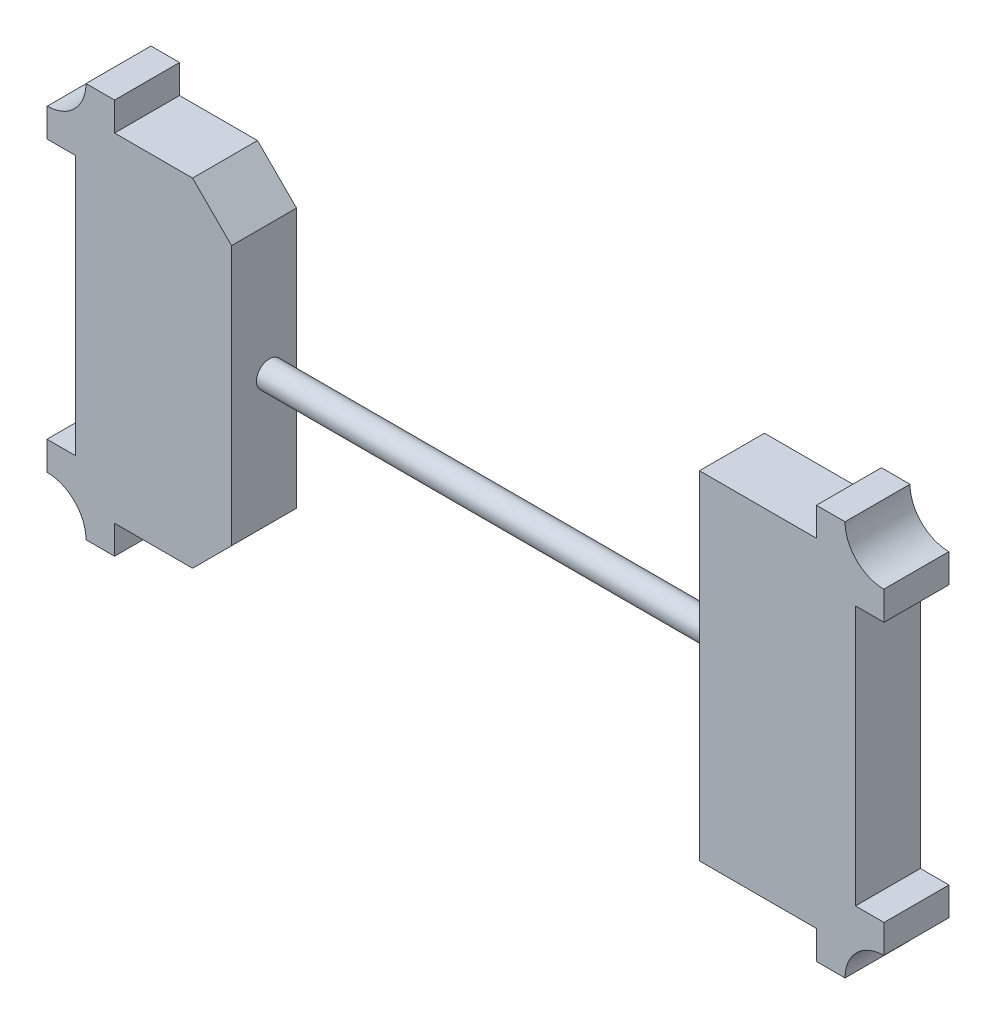
ISO-10303-21;
HEADER;
FILE_DESCRIPTION(('STEP AP214'),'2;1');
FILE_NAME('part.step','',(''),(''),'','','');
FILE_SCHEMA(('AUTOMOTIVE_DESIGN { 1 0 10303 214 1 1 1 1 }'));
ENDSEC;
DATA;
#1=APPLICATION_CONTEXT('core data for automotive mechanical design processes');
#2=APPLICATION_PROTOCOL_DEFINITION('international standard','automotive_design',2000,#1);
#3=PRODUCT_CONTEXT('',#1,'mechanical');
#4=PRODUCT('Part','Part','',(#3));
#5=PRODUCT_RELATED_PRODUCT_CATEGORY('part','',(#4));
#6=PRODUCT_DEFINITION_FORMATION('','',#4);
#7=PRODUCT_DEFINITION_CONTEXT('part definition',#1,'design');
#8=PRODUCT_DEFINITION('design','',#6,#7);
#9=PRODUCT_DEFINITION_SHAPE('','',#8);
#10=(LENGTH_UNIT() NAMED_UNIT(*) SI_UNIT(.MILLI.,.METRE.));
#11=(NAMED_UNIT(*) PLANE_ANGLE_UNIT() SI_UNIT($,.RADIAN.));
#12=(NAMED_UNIT(*) SI_UNIT($,.STERADIAN.) SOLID_ANGLE_UNIT());
#13=UNCERTAINTY_MEASURE_WITH_UNIT(LENGTH_MEASURE(1.E-05),#10,'distance_accuracy_value','');
#14=(GEOMETRIC_REPRESENTATION_CONTEXT(3) GLOBAL_UNCERTAINTY_ASSIGNED_CONTEXT((#13)) GLOBAL_UNIT_ASSIGNED_CONTEXT((#10,
#11,#12)) REPRESENTATION_CONTEXT('',''));
#15=CARTESIAN_POINT('',(0.,0.,0.));
#16=DIRECTION('',(0.,0.,1.));
#17=DIRECTION('',(1.,0.,0.));
#18=AXIS2_PLACEMENT_3D('',#15,#16,#17);
#19=CARTESIAN_POINT('',(-1.609999999916,0.759994982704,0.));
#20=DIRECTION('',(0.,0.,1.));
#21=DIRECTION('',(1.,0.,0.));
#22=AXIS2_PLACEMENT_3D('',#19,#20,#21);
#23=CYLINDRICAL_SURFACE('',#22,0.15);
#24=DIRECTION('',(0.,0.,1.));
#25=VECTOR('',#24,1.);
#26=CARTESIAN_POINT('',(-1.609202,0.609997105398286,0.));
#27=LINE('',#26,#25);
#28=CARTESIAN_POINT('',(-1.609202,0.609997105398429,0.25));
#29=VERTEX_POINT('',#28);
#30=CARTESIAN_POINT('',(-1.609202,0.609997105398429,0.));
#31=VERTEX_POINT('',#30);
#32=EDGE_CURVE('E334',#29,#31,#27,.F.);
#33=ORIENTED_EDGE('',*,*,#32,.F.);
#34=CARTESIAN_POINT('',(-1.609999999916,0.759994982704,0.25));
#35=DIRECTION('',(0.,0.,1.));
#36=DIRECTION('',(1.,0.,0.));
#37=AXIS2_PLACEMENT_3D('',#34,#35,#36);
#38=CIRCLE('',#37,0.15);
#39=CARTESIAN_POINT('',(-1.45999999999993,0.76,0.25));
#40=VERTEX_POINT('',#39);
#41=EDGE_CURVE('E242',#40,#29,#38,.F.);
#42=ORIENTED_EDGE('',*,*,#41,.F.);
#43=DIRECTION('',(0.,0.,1.));
#44=VECTOR('',#43,1.);
#45=CARTESIAN_POINT('',(-1.45999999999996,0.76,0.));
#46=LINE('',#45,#44);
#47=CARTESIAN_POINT('',(-1.45999999999993,0.76,0.));
#48=VERTEX_POINT('',#47);
#49=EDGE_CURVE('E246',#48,#40,#46,.T.);
#50=ORIENTED_EDGE('',*,*,#49,.F.);
#51=CARTESIAN_POINT('',(-1.609999999916,0.759994982704,0.));
#52=DIRECTION('',(0.,0.,1.));
#53=DIRECTION('',(1.,0.,0.));
#54=AXIS2_PLACEMENT_3D('',#51,#52,#53);
#55=CIRCLE('',#54,0.15);
#56=EDGE_CURVE('E240',#48,#31,#55,.F.);
#57=ORIENTED_EDGE('',*,*,#56,.T.);
#58=EDGE_LOOP('',(#33,#42,#50,#57));
#59=FACE_BOUND('',#58,.T.);
#60=ADVANCED_FACE('F16',(#59),#23,.F.);
#61=CARTESIAN_POINT('',(-1.609601,0.554998552699,0.));
#62=DIRECTION('',(-0.999973685438896,0.00725454545452425,0.));
#63=DIRECTION('',(-0.00725454545452425,-0.999973685438896,0.));
#64=AXIS2_PLACEMENT_3D('',#61,#62,#63);
#65=PLANE('',#64);
#66=DIRECTION('',(-0.00725454545455075,-0.999973685438896,0.));
#67=VECTOR('',#66,1.);
#68=CARTESIAN_POINT('',(-1.609202,0.609997105398286,0.));
#69=LINE('',#68,#67);
#70=CARTESIAN_POINT('',(-1.61,0.5,0.));
#71=VERTEX_POINT('',#70);
#72=EDGE_CURVE('E329',#31,#71,#69,.T.);
#73=ORIENTED_EDGE('',*,*,#72,.T.);
#74=DIRECTION('',(0.,0.,1.));
#75=VECTOR('',#74,1.);
#76=CARTESIAN_POINT('',(-1.61,0.5,0.));
#77=LINE('',#76,#75);
#78=CARTESIAN_POINT('',(-1.61,0.5,0.25));
#79=VERTEX_POINT('',#78);
#80=EDGE_CURVE('E325',#79,#71,#77,.F.);
#81=ORIENTED_EDGE('',*,*,#80,.F.);
#82=DIRECTION('',(-0.00725454545455075,-0.999973685438896,0.));
#83=VECTOR('',#82,1.);
#84=CARTESIAN_POINT('',(-1.609202,0.609997105398286,0.25));
#85=LINE('',#84,#83);
#86=EDGE_CURVE('E244',#29,#79,#85,.T.);
#87=ORIENTED_EDGE('',*,*,#86,.F.);
#88=ORIENTED_EDGE('',*,*,#32,.T.);
#89=EDGE_LOOP('',(#73,#81,#87,#88));
#90=FACE_BOUND('',#89,.T.);
#91=ADVANCED_FACE('F744',(#90),#65,.T.);
#92=CARTESIAN_POINT('',(-1.555,0.5,0.));
#93=DIRECTION('',(0.,-1.,0.));
#94=DIRECTION('',(1.,0.,0.));
#95=AXIS2_PLACEMENT_3D('',#92,#93,#94);
#96=PLANE('',#95);
#97=DIRECTION('',(1.,0.,0.));
#98=VECTOR('',#97,1.);
#99=CARTESIAN_POINT('',(-1.26844322738,0.5,0.));
#100=LINE('',#99,#98);
#101=CARTESIAN_POINT('',(-1.5,0.5,0.));
#102=VERTEX_POINT('',#101);
#103=EDGE_CURVE('E320',#71,#102,#100,.T.);
#104=ORIENTED_EDGE('',*,*,#103,.T.);
#105=DIRECTION('',(0.,0.,1.));
#106=VECTOR('',#105,1.);
#107=CARTESIAN_POINT('',(-1.5,0.5,0.));
#108=LINE('',#107,#106);
#109=CARTESIAN_POINT('',(-1.5,0.5,0.25));
#110=VERTEX_POINT('',#109);
#111=EDGE_CURVE('E316',#110,#102,#108,.F.);
#112=ORIENTED_EDGE('',*,*,#111,.F.);
#113=DIRECTION('',(1.,0.,0.));
#114=VECTOR('',#113,1.);
#115=CARTESIAN_POINT('',(-1.26844322738,0.5,0.25));
#116=LINE('',#115,#114);
#117=EDGE_CURVE('E349',#79,#110,#116,.T.);
#118=ORIENTED_EDGE('',*,*,#117,.F.);
#119=ORIENTED_EDGE('',*,*,#80,.T.);
#120=EDGE_LOOP('',(#104,#112,#118,#119));
#121=FACE_BOUND('',#120,.T.);
#122=ADVANCED_FACE('F735',(#121),#96,.T.);
#123=CARTESIAN_POINT('',(-1.5,0.25,0.));
#124=DIRECTION('',(-1.,0.,0.));
#125=DIRECTION('',(0.,0.,1.));
#126=AXIS2_PLACEMENT_3D('',#123,#124,#125);
#127=PLANE('',#126);
#128=DIRECTION('',(0.,1.,0.));
#129=VECTOR('',#128,1.);
#130=CARTESIAN_POINT('',(-1.5,0.,0.));
#131=LINE('',#130,#129);
#132=CARTESIAN_POINT('',(-1.5,-0.5,0.));
#133=VERTEX_POINT('',#132);
#134=EDGE_CURVE('E311',#102,#133,#131,.F.);
#135=ORIENTED_EDGE('',*,*,#134,.T.);
#136=DIRECTION('',(0.,0.,1.));
#137=VECTOR('',#136,1.);
#138=CARTESIAN_POINT('',(-1.5,-0.5,0.));
#139=LINE('',#138,#137);
#140=CARTESIAN_POINT('',(-1.5,-0.5,0.25));
#141=VERTEX_POINT('',#140);
#142=EDGE_CURVE('E305',#141,#133,#139,.F.);
#143=ORIENTED_EDGE('',*,*,#142,.F.);
#144=DIRECTION('',(0.,1.,0.));
#145=VECTOR('',#144,1.);
#146=CARTESIAN_POINT('',(-1.5,0.,0.25));
#147=LINE('',#146,#145);
#148=EDGE_CURVE('E344',#110,#141,#147,.F.);
#149=ORIENTED_EDGE('',*,*,#148,.F.);
#150=ORIENTED_EDGE('',*,*,#111,.T.);
#151=EDGE_LOOP('',(#135,#143,#149,#150));
#152=FACE_BOUND('',#151,.T.);
#153=ADVANCED_FACE('F726',(#152),#127,.T.);
#154=CARTESIAN_POINT('',(-1.555,-0.5,0.));
#155=DIRECTION('',(0.,1.,0.));
#156=DIRECTION('',(-1.,0.,0.));
#157=AXIS2_PLACEMENT_3D('',#154,#155,#156);
#158=PLANE('',#157);
#159=DIRECTION('',(1.,0.,0.));
#160=VECTOR('',#159,1.);
#161=CARTESIAN_POINT('',(-1.26844322738,-0.5,0.));
#162=LINE('',#161,#160);
#163=CARTESIAN_POINT('',(-1.61,-0.5,0.));
#164=VERTEX_POINT('',#163);
#165=EDGE_CURVE('E308',#133,#164,#162,.F.);
#166=ORIENTED_EDGE('',*,*,#165,.T.);
#167=DIRECTION('',(0.,0.,1.));
#168=VECTOR('',#167,1.);
#169=CARTESIAN_POINT('',(-1.61,-0.5,0.));
#170=LINE('',#169,#168);
#171=CARTESIAN_POINT('',(-1.61,-0.5,0.25));
#172=VERTEX_POINT('',#171);
#173=EDGE_CURVE('E302',#172,#164,#170,.F.);
#174=ORIENTED_EDGE('',*,*,#173,.F.);
#175=DIRECTION('',(1.,0.,0.));
#176=VECTOR('',#175,1.);
#177=CARTESIAN_POINT('',(-1.26844322738,-0.5,0.25));
#178=LINE('',#177,#176);
#179=EDGE_CURVE('E236',#141,#172,#178,.F.);
#180=ORIENTED_EDGE('',*,*,#179,.F.);
#181=ORIENTED_EDGE('',*,*,#142,.T.);
#182=EDGE_LOOP('',(#166,#174,#180,#181));
#183=FACE_BOUND('',#182,.T.);
#184=ADVANCED_FACE('F718',(#183),#158,.T.);
#185=CARTESIAN_POINT('',(-1.609601,-0.554998552699,0.));
#186=DIRECTION('',(-0.999973685438896,-0.00725454545452625,0.));
#187=DIRECTION('',(0.00725454545452625,-0.999973685438896,0.));
#188=AXIS2_PLACEMENT_3D('',#185,#186,#187);
#189=PLANE('',#188);
#190=DIRECTION('',(0.007254545454522,-0.999973685438896,0.));
#191=VECTOR('',#190,1.);
#192=CARTESIAN_POINT('',(-1.61,-0.5,0.));
#193=LINE('',#192,#191);
#194=CARTESIAN_POINT('',(-1.609202,-0.609997105398573,0.));
#195=VERTEX_POINT('',#194);
#196=EDGE_CURVE('E310',#164,#195,#193,.T.);
#197=ORIENTED_EDGE('',*,*,#196,.T.);
#198=DIRECTION('',(0.,0.,1.));
#199=VECTOR('',#198,1.);
#200=CARTESIAN_POINT('',(-1.609202,-0.609997105398573,0.));
#201=LINE('',#200,#199);
#202=CARTESIAN_POINT('',(-1.609202,-0.609997105398573,0.25));
#203=VERTEX_POINT('',#202);
#204=EDGE_CURVE('E221',#195,#203,#201,.T.);
#205=ORIENTED_EDGE('',*,*,#204,.T.);
#206=DIRECTION('',(0.00725454545452397,-0.999973685438896,0.));
#207=VECTOR('',#206,1.);
#208=CARTESIAN_POINT('',(-1.61,-0.5,0.25));
#209=LINE('',#208,#207);
#210=EDGE_CURVE('E234',#172,#203,#209,.T.);
#211=ORIENTED_EDGE('',*,*,#210,.F.);
#212=ORIENTED_EDGE('',*,*,#173,.T.);
#213=EDGE_LOOP('',(#197,#205,#211,#212));
#214=FACE_BOUND('',#213,.T.);
#215=ADVANCED_FACE('F710',(#214),#189,.T.);
#216=CARTESIAN_POINT('',(-1.609999999916,-0.759994982704,0.));
#217=DIRECTION('',(0.,0.,1.));
#218=DIRECTION('',(1.,0.,0.));
#219=AXIS2_PLACEMENT_3D('',#216,#217,#218);
#220=CYLINDRICAL_SURFACE('',#219,0.15);
#221=DIRECTION('',(0.,0.,1.));
#222=VECTOR('',#221,1.);
#223=CARTESIAN_POINT('',(-1.45999999999996,-0.76,0.));
#224=LINE('',#223,#222);
#225=CARTESIAN_POINT('',(-1.45999999999993,-0.76,0.25));
#226=VERTEX_POINT('',#225);
#227=CARTESIAN_POINT('',(-1.45999999999993,-0.76,0.));
#228=VERTEX_POINT('',#227);
#229=EDGE_CURVE('E19',#226,#228,#224,.F.);
#230=ORIENTED_EDGE('',*,*,#229,.F.);
#231=CARTESIAN_POINT('',(-1.609999999916,-0.759994982704,0.25));
#232=DIRECTION('',(0.,0.,1.));
#233=DIRECTION('',(1.,0.,0.));
#234=AXIS2_PLACEMENT_3D('',#231,#232,#233);
#235=CIRCLE('',#234,0.15);
#236=EDGE_CURVE('E214',#203,#226,#235,.F.);
#237=ORIENTED_EDGE('',*,*,#236,.F.);
#238=ORIENTED_EDGE('',*,*,#204,.F.);
#239=CARTESIAN_POINT('',(-1.609999999916,-0.759994982704,0.));
#240=DIRECTION('',(0.,0.,1.));
#241=DIRECTION('',(1.,0.,0.));
#242=AXIS2_PLACEMENT_3D('',#239,#240,#241);
#243=CIRCLE('',#242,0.15);
#244=EDGE_CURVE('E217',#195,#228,#243,.F.);
#245=ORIENTED_EDGE('',*,*,#244,.T.);
#246=EDGE_LOOP('',(#230,#237,#238,#245));
#247=FACE_BOUND('',#246,.T.);
#248=ADVANCED_FACE('F211',(#247),#220,.F.);
#249=CARTESIAN_POINT('',(-1.405,-0.76,0.));
#250=DIRECTION('',(0.,-1.,0.));
#251=DIRECTION('',(1.,0.,0.));
#252=AXIS2_PLACEMENT_3D('',#249,#250,#251);
#253=PLANE('',#252);
#254=DIRECTION('',(1.,0.,0.));
#255=VECTOR('',#254,1.);
#256=CARTESIAN_POINT('',(-1.26844322738,-0.76,0.));
#257=LINE('',#256,#255);
#258=CARTESIAN_POINT('',(-1.35,-0.76,0.));
#259=VERTEX_POINT('',#258);
#260=EDGE_CURVE('E298',#228,#259,#257,.T.);
#261=ORIENTED_EDGE('',*,*,#260,.T.);
#262=DIRECTION('',(0.,0.,1.));
#263=VECTOR('',#262,1.);
#264=CARTESIAN_POINT('',(-1.35,-0.76,0.));
#265=LINE('',#264,#263);
#266=CARTESIAN_POINT('',(-1.35,-0.76,0.25));
#267=VERTEX_POINT('',#266);
#268=EDGE_CURVE('E220',#267,#259,#265,.F.);
#269=ORIENTED_EDGE('',*,*,#268,.F.);
#270=DIRECTION('',(1.,0.,0.));
#271=VECTOR('',#270,1.);
#272=CARTESIAN_POINT('',(-1.26844322738,-0.76,0.25));
#273=LINE('',#272,#271);
#274=EDGE_CURVE('E223',#226,#267,#273,.T.);
#275=ORIENTED_EDGE('',*,*,#274,.F.);
#276=ORIENTED_EDGE('',*,*,#229,.T.);
#277=EDGE_LOOP('',(#261,#269,#275,#276));
#278=FACE_BOUND('',#277,.T.);
#279=ADVANCED_FACE('F224',(#278),#253,.T.);
#280=CARTESIAN_POINT('',(-1.35,-0.705,0.));
#281=DIRECTION('',(1.,0.,0.));
#282=DIRECTION('',(0.,1.,0.));
#283=AXIS2_PLACEMENT_3D('',#280,#281,#282);
#284=PLANE('',#283);
#285=DIRECTION('',(0.,1.,0.));
#286=VECTOR('',#285,1.);
#287=CARTESIAN_POINT('',(-1.35,0.,0.));
#288=LINE('',#287,#286);
#289=CARTESIAN_POINT('',(-1.35,-0.65,0.));
#290=VERTEX_POINT('',#289);
#291=EDGE_CURVE('E295',#259,#290,#288,.T.);
#292=ORIENTED_EDGE('',*,*,#291,.T.);
#293=DIRECTION('',(0.,0.,1.));
#294=VECTOR('',#293,1.);
#295=CARTESIAN_POINT('',(-1.35,-0.649999999999999,0.));
#296=LINE('',#295,#294);
#297=CARTESIAN_POINT('',(-1.35,-0.65,0.25));
#298=VERTEX_POINT('',#297);
#299=EDGE_CURVE('E256',#298,#290,#296,.F.);
#300=ORIENTED_EDGE('',*,*,#299,.F.);
#301=DIRECTION('',(0.,1.,0.));
#302=VECTOR('',#301,1.);
#303=CARTESIAN_POINT('',(-1.35,0.,0.25));
#304=LINE('',#303,#302);
#305=EDGE_CURVE('E229',#267,#298,#304,.T.);
#306=ORIENTED_EDGE('',*,*,#305,.F.);
#307=ORIENTED_EDGE('',*,*,#268,.T.);
#308=EDGE_LOOP('',(#292,#300,#306,#307));
#309=FACE_BOUND('',#308,.T.);
#310=ADVANCED_FACE('F686',(#309),#284,.T.);
#311=CARTESIAN_POINT('',(-1.2,-0.65,0.));
#312=DIRECTION('',(0.,-1.,0.));
#313=DIRECTION('',(1.,0.,0.));
#314=AXIS2_PLACEMENT_3D('',#311,#312,#313);
#315=PLANE('',#314);
#316=DIRECTION('',(1.,0.,0.));
#317=VECTOR('',#316,1.);
#318=CARTESIAN_POINT('',(-1.26844322738,-0.65,0.));
#319=LINE('',#318,#317);
#320=CARTESIAN_POINT('',(-1.05,-0.650000000000001,0.));
#321=VERTEX_POINT('',#320);
#322=EDGE_CURVE('E297',#290,#321,#319,.T.);
#323=ORIENTED_EDGE('',*,*,#322,.T.);
#324=DIRECTION('',(0.,0.,1.));
#325=VECTOR('',#324,1.);
#326=CARTESIAN_POINT('',(-1.05,-0.65,0.));
#327=LINE('',#326,#325);
#328=CARTESIAN_POINT('',(-1.05,-0.65,0.25));
#329=VERTEX_POINT('',#328);
#330=EDGE_CURVE('E408',#329,#321,#327,.F.);
#331=ORIENTED_EDGE('',*,*,#330,.F.);
#332=DIRECTION('',(1.,0.,0.));
#333=VECTOR('',#332,1.);
#334=CARTESIAN_POINT('',(-1.26844322738,-0.65,0.25));
#335=LINE('',#334,#333);
#336=EDGE_CURVE('E340',#298,#329,#335,.T.);
#337=ORIENTED_EDGE('',*,*,#336,.F.);
#338=ORIENTED_EDGE('',*,*,#299,.T.);
#339=EDGE_LOOP('',(#323,#331,#337,#338));
#340=FACE_BOUND('',#339,.T.);
#341=ADVANCED_FACE('F437',(#340),#315,.T.);
#342=CARTESIAN_POINT('',(-1.35,0.705,0.));
#343=DIRECTION('',(1.,0.,0.));
#344=DIRECTION('',(0.,1.,0.));
#345=AXIS2_PLACEMENT_3D('',#342,#343,#344);
#346=PLANE('',#345);
#347=DIRECTION('',(0.,1.,0.));
#348=VECTOR('',#347,1.);
#349=CARTESIAN_POINT('',(-1.35,0.,0.));
#350=LINE('',#349,#348);
#351=CARTESIAN_POINT('',(-1.35,0.65,0.));
#352=VERTEX_POINT('',#351);
#353=CARTESIAN_POINT('',(-1.35,0.76,0.));
#354=VERTEX_POINT('',#353);
#355=EDGE_CURVE('E267',#352,#354,#350,.T.);
#356=ORIENTED_EDGE('',*,*,#355,.T.);
#357=DIRECTION('',(0.,0.,1.));
#358=VECTOR('',#357,1.);
#359=CARTESIAN_POINT('',(-1.35,0.76,0.));
#360=LINE('',#359,#358);
#361=CARTESIAN_POINT('',(-1.35,0.76,0.25));
#362=VERTEX_POINT('',#361);
#363=EDGE_CURVE('E248',#362,#354,#360,.F.);
#364=ORIENTED_EDGE('',*,*,#363,.F.);
#365=DIRECTION('',(0.,1.,0.));
#366=VECTOR('',#365,1.);
#367=CARTESIAN_POINT('',(-1.35,0.,0.25));
#368=LINE('',#367,#366);
#369=CARTESIAN_POINT('',(-1.35,0.65,0.25));
#370=VERTEX_POINT('',#369);
#371=EDGE_CURVE('E356',#370,#362,#368,.T.);
#372=ORIENTED_EDGE('',*,*,#371,.F.);
#373=DIRECTION('',(0.,0.,1.));
#374=VECTOR('',#373,1.);
#375=CARTESIAN_POINT('',(-1.35,0.65,0.));
#376=LINE('',#375,#374);
#377=EDGE_CURVE('E247',#352,#370,#376,.T.);
#378=ORIENTED_EDGE('',*,*,#377,.F.);
#379=EDGE_LOOP('',(#356,#364,#372,#378));
#380=FACE_BOUND('',#379,.T.);
#381=ADVANCED_FACE('F428',(#380),#346,.T.);
#382=CARTESIAN_POINT('',(-1.405,0.76,0.));
#383=DIRECTION('',(0.,1.,0.));
#384=DIRECTION('',(-1.,0.,0.));
#385=AXIS2_PLACEMENT_3D('',#382,#383,#384);
#386=PLANE('',#385);
#387=DIRECTION('',(1.,0.,0.));
#388=VECTOR('',#387,1.);
#389=CARTESIAN_POINT('',(-1.26844322738,0.76,0.));
#390=LINE('',#389,#388);
#391=EDGE_CURVE('E269',#354,#48,#390,.F.);
#392=ORIENTED_EDGE('',*,*,#391,.T.);
#393=ORIENTED_EDGE('',*,*,#49,.T.);
#394=DIRECTION('',(1.,0.,0.));
#395=VECTOR('',#394,1.);
#396=CARTESIAN_POINT('',(-1.26844322738,0.76,0.25));
#397=LINE('',#396,#395);
#398=EDGE_CURVE('E245',#362,#40,#397,.F.);
#399=ORIENTED_EDGE('',*,*,#398,.F.);
#400=ORIENTED_EDGE('',*,*,#363,.T.);
#401=EDGE_LOOP('',(#392,#393,#399,#400));
#402=FACE_BOUND('',#401,.T.);
#403=ADVANCED_FACE('F424',(#402),#386,.T.);
#404=CARTESIAN_POINT('',(-1.2,0.65,0.));
#405=DIRECTION('',(0.,1.,0.));
#406=DIRECTION('',(-1.,0.,0.));
#407=AXIS2_PLACEMENT_3D('',#404,#405,#406);
#408=PLANE('',#407);
#409=DIRECTION('',(1.,0.,0.));
#410=VECTOR('',#409,1.);
#411=CARTESIAN_POINT('',(-1.26844322738,0.65,0.));
#412=LINE('',#411,#410);
#413=CARTESIAN_POINT('',(-1.05,0.65,0.));
#414=VERTEX_POINT('',#413);
#415=EDGE_CURVE('E270',#414,#352,#412,.F.);
#416=ORIENTED_EDGE('',*,*,#415,.T.);
#417=ORIENTED_EDGE('',*,*,#377,.T.);
#418=DIRECTION('',(1.,0.,0.));
#419=VECTOR('',#418,1.);
#420=CARTESIAN_POINT('',(-1.26844322738,0.65,0.25));
#421=LINE('',#420,#419);
#422=CARTESIAN_POINT('',(-1.05,0.65,0.25));
#423=VERTEX_POINT('',#422);
#424=EDGE_CURVE('E253',#423,#370,#421,.F.);
#425=ORIENTED_EDGE('',*,*,#424,.F.);
#426=DIRECTION('',(0.,0.,1.));
#427=VECTOR('',#426,1.);
#428=CARTESIAN_POINT('',(-1.05,0.65,0.));
#429=LINE('',#428,#427);
#430=EDGE_CURVE('E280',#414,#423,#429,.T.);
#431=ORIENTED_EDGE('',*,*,#430,.F.);
#432=EDGE_LOOP('',(#416,#417,#425,#431));
#433=FACE_BOUND('',#432,.T.);
#434=ADVANCED_FACE('F427',(#433),#408,.T.);
#435=CARTESIAN_POINT('',(-1.26844322738,0.,0.25));
#436=DIRECTION('',(0.,0.,1.));
#437=DIRECTION('',(1.,0.,0.));
#438=AXIS2_PLACEMENT_3D('',#435,#436,#437);
#439=PLANE('',#438);
#440=DIRECTION('',(0.707106781186548,0.707106781186548,0.));
#441=VECTOR('',#440,1.);
#442=CARTESIAN_POINT('',(-0.975,-0.575,0.25));
#443=LINE('',#442,#441);
#444=CARTESIAN_POINT('',(-0.9,-0.5,0.25));
#445=VERTEX_POINT('',#444);
#446=EDGE_CURVE('E411',#445,#329,#443,.F.);
#447=ORIENTED_EDGE('',*,*,#446,.F.);
#448=DIRECTION('',(0.,1.,0.));
#449=VECTOR('',#448,1.);
#450=CARTESIAN_POINT('',(-0.9,-0.25,0.25));
#451=LINE('',#450,#449);
#452=CARTESIAN_POINT('',(-0.9,0.5,0.25));
#453=VERTEX_POINT('',#452);
#454=EDGE_CURVE('E283',#453,#445,#451,.F.);
#455=ORIENTED_EDGE('',*,*,#454,.F.);
#456=DIRECTION('',(-0.707106781186548,0.707106781186548,0.));
#457=VECTOR('',#456,1.);
#458=CARTESIAN_POINT('',(-0.975,0.575,0.25));
#459=LINE('',#458,#457);
#460=EDGE_CURVE('E289',#423,#453,#459,.F.);
#461=ORIENTED_EDGE('',*,*,#460,.F.);
#462=ORIENTED_EDGE('',*,*,#424,.T.);
#463=ORIENTED_EDGE('',*,*,#371,.T.);
#464=ORIENTED_EDGE('',*,*,#398,.T.);
#465=ORIENTED_EDGE('',*,*,#41,.T.);
#466=ORIENTED_EDGE('',*,*,#86,.T.);
#467=ORIENTED_EDGE('',*,*,#117,.T.);
#468=ORIENTED_EDGE('',*,*,#148,.T.);
#469=ORIENTED_EDGE('',*,*,#179,.T.);
#470=ORIENTED_EDGE('',*,*,#210,.T.);
#471=ORIENTED_EDGE('',*,*,#236,.T.);
#472=ORIENTED_EDGE('',*,*,#274,.T.);
#473=ORIENTED_EDGE('',*,*,#305,.T.);
#474=ORIENTED_EDGE('',*,*,#336,.T.);
#475=EDGE_LOOP('',(#447,#455,#461,#462,#463,#464,#465,#466,#467,#468,#469,#470,#471,#472,#473,#474));
#476=FACE_BOUND('',#475,.T.);
#477=ADVANCED_FACE('F231',(#476),#439,.T.);
#478=CARTESIAN_POINT('',(-0.975,-0.575,0.));
#479=DIRECTION('',(0.707106781186548,-0.707106781186548,0.));
#480=DIRECTION('',(0.707106781186548,0.707106781186548,0.));
#481=AXIS2_PLACEMENT_3D('',#478,#479,#480);
#482=PLANE('',#481);
#483=DIRECTION('',(0.707106781186547,0.707106781186548,0.));
#484=VECTOR('',#483,1.);
#485=CARTESIAN_POINT('',(-1.05,-0.65,0.));
#486=LINE('',#485,#484);
#487=CARTESIAN_POINT('',(-0.9,-0.5,0.));
#488=VERTEX_POINT('',#487);
#489=EDGE_CURVE('E275',#321,#488,#486,.T.);
#490=ORIENTED_EDGE('',*,*,#489,.T.);
#491=DIRECTION('',(0.,0.,-1.));
#492=VECTOR('',#491,1.);
#493=CARTESIAN_POINT('',(-0.9,-0.5,0.));
#494=LINE('',#493,#492);
#495=EDGE_CURVE('E793',#445,#488,#494,.T.);
#496=ORIENTED_EDGE('',*,*,#495,.F.);
#497=ORIENTED_EDGE('',*,*,#446,.T.);
#498=ORIENTED_EDGE('',*,*,#330,.T.);
#499=EDGE_LOOP('',(#490,#496,#497,#498));
#500=FACE_BOUND('',#499,.T.);
#501=ADVANCED_FACE('F522',(#500),#482,.T.);
#502=CARTESIAN_POINT('',(-1.26844322738,0.,0.));
#503=DIRECTION('',(0.,0.,1.));
#504=DIRECTION('',(1.,0.,0.));
#505=AXIS2_PLACEMENT_3D('',#502,#503,#504);
#506=PLANE('',#505);
#507=ORIENTED_EDGE('',*,*,#355,.F.);
#508=ORIENTED_EDGE('',*,*,#415,.F.);
#509=DIRECTION('',(-0.707106781186548,0.707106781186548,0.));
#510=VECTOR('',#509,1.);
#511=CARTESIAN_POINT('',(-0.975,0.575,0.));
#512=LINE('',#511,#510);
#513=CARTESIAN_POINT('',(-0.9,0.5,0.));
#514=VERTEX_POINT('',#513);
#515=EDGE_CURVE('E284',#514,#414,#512,.T.);
#516=ORIENTED_EDGE('',*,*,#515,.F.);
#517=DIRECTION('',(0.,1.,0.));
#518=VECTOR('',#517,1.);
#519=CARTESIAN_POINT('',(-0.9,-0.25,0.));
#520=LINE('',#519,#518);
#521=EDGE_CURVE('E797',#488,#514,#520,.T.);
#522=ORIENTED_EDGE('',*,*,#521,.F.);
#523=ORIENTED_EDGE('',*,*,#489,.F.);
#524=ORIENTED_EDGE('',*,*,#322,.F.);
#525=ORIENTED_EDGE('',*,*,#291,.F.);
#526=ORIENTED_EDGE('',*,*,#260,.F.);
#527=ORIENTED_EDGE('',*,*,#244,.F.);
#528=ORIENTED_EDGE('',*,*,#196,.F.);
#529=ORIENTED_EDGE('',*,*,#165,.F.);
#530=ORIENTED_EDGE('',*,*,#134,.F.);
#531=ORIENTED_EDGE('',*,*,#103,.F.);
#532=ORIENTED_EDGE('',*,*,#72,.F.);
#533=ORIENTED_EDGE('',*,*,#56,.F.);
#534=ORIENTED_EDGE('',*,*,#391,.F.);
#535=EDGE_LOOP('',(#507,#508,#516,#522,#523,#524,#525,#526,#527,#528,#529,#530,#531,#532,#533,#534));
#536=FACE_BOUND('',#535,.T.);
#537=ADVANCED_FACE('F518',(#536),#506,.F.);
#538=CARTESIAN_POINT('',(-0.975,0.575,0.));
#539=DIRECTION('',(0.707106781186548,0.707106781186548,0.));
#540=DIRECTION('',(-0.707106781186548,0.707106781186548,0.));
#541=AXIS2_PLACEMENT_3D('',#538,#539,#540);
#542=PLANE('',#541);
#543=ORIENTED_EDGE('',*,*,#515,.T.);
#544=ORIENTED_EDGE('',*,*,#430,.T.);
#545=ORIENTED_EDGE('',*,*,#460,.T.);
#546=DIRECTION('',(0.,0.,-1.));
#547=VECTOR('',#546,1.);
#548=CARTESIAN_POINT('',(-0.9,0.5,0.));
#549=LINE('',#548,#547);
#550=EDGE_CURVE('E395',#514,#453,#549,.F.);
#551=ORIENTED_EDGE('',*,*,#550,.F.);
#552=EDGE_LOOP('',(#543,#544,#545,#551));
#553=FACE_BOUND('',#552,.T.);
#554=ADVANCED_FACE('F514',(#553),#542,.T.);
#555=CARTESIAN_POINT('',(-0.9,-0.25,0.));
#556=DIRECTION('',(1.,0.,0.));
#557=DIRECTION('',(0.,0.,-1.));
#558=AXIS2_PLACEMENT_3D('',#555,#556,#557);
#559=PLANE('',#558);
#560=ORIENTED_EDGE('',*,*,#521,.T.);
#561=ORIENTED_EDGE('',*,*,#550,.T.);
#562=ORIENTED_EDGE('',*,*,#454,.T.);
#563=ORIENTED_EDGE('',*,*,#495,.T.);
#564=EDGE_LOOP('',(#560,#561,#562,#563));
#565=FACE_BOUND('',#564,.T.);
#566=CARTESIAN_POINT('',(-0.9,0.,0.104128421099));
#567=DIRECTION('',(-1.,0.,0.));
#568=DIRECTION('',(0.,0.,1.));
#569=AXIS2_PLACEMENT_3D('',#566,#567,#568);
#570=CIRCLE('',#569,0.05);
#571=CARTESIAN_POINT('',(-0.9,0.,0.154128421099));
#572=VERTEX_POINT('',#571);
#573=EDGE_CURVE('E392',#572,#572,#570,.F.);
#574=ORIENTED_EDGE('',*,*,#573,.F.);
#575=EDGE_LOOP('',(#574));
#576=FACE_BOUND('',#575,.T.);
#577=ADVANCED_FACE('F510',(#565,#576),#559,.T.);
#578=CARTESIAN_POINT('',(0.9,0.,0.104128421099));
#579=DIRECTION('',(-1.,0.,0.));
#580=DIRECTION('',(0.,0.,1.));
#581=AXIS2_PLACEMENT_3D('',#578,#579,#580);
#582=CYLINDRICAL_SURFACE('',#581,0.05);
#583=ORIENTED_EDGE('',*,*,#573,.T.);
#584=EDGE_LOOP('',(#583));
#585=FACE_BOUND('',#584,.T.);
#586=CARTESIAN_POINT('',(0.9,0.,0.104128421099));
#587=DIRECTION('',(-1.,0.,0.));
#588=DIRECTION('',(0.,0.,1.));
#589=AXIS2_PLACEMENT_3D('',#586,#587,#588);
#590=CIRCLE('',#589,0.05);
#591=CARTESIAN_POINT('',(0.9,0.,0.154128421099));
#592=VERTEX_POINT('',#591);
#593=EDGE_CURVE('E378',#592,#592,#590,.F.);
#594=ORIENTED_EDGE('',*,*,#593,.F.);
#595=EDGE_LOOP('',(#594));
#596=FACE_BOUND('',#595,.T.);
#597=ADVANCED_FACE('F506',(#585,#596),#582,.T.);
#598=CARTESIAN_POINT('',(1.252163190186,0.,0.));
#599=DIRECTION('',(0.,0.,1.));
#600=DIRECTION('',(1.,0.,0.));
#601=AXIS2_PLACEMENT_3D('',#598,#599,#600);
#602=PLANE('',#601);
#603=DIRECTION('',(-0.00725454545452925,0.999973685438896,0.));
#604=VECTOR('',#603,1.);
#605=CARTESIAN_POINT('',(1.609601,0.554998552699,0.));
#606=LINE('',#605,#604);
#607=CARTESIAN_POINT('',(1.61,0.5,0.));
#608=VERTEX_POINT('',#607);
#609=CARTESIAN_POINT('',(1.609202,0.609997105398573,0.));
#610=VERTEX_POINT('',#609);
#611=EDGE_CURVE('E829',#608,#610,#606,.T.);
#612=ORIENTED_EDGE('',*,*,#611,.F.);
#613=DIRECTION('',(1.,0.,0.));
#614=VECTOR('',#613,1.);
#615=CARTESIAN_POINT('',(1.555,0.5,0.));
#616=LINE('',#615,#614);
#617=CARTESIAN_POINT('',(1.5,0.499999999999999,0.));
#618=VERTEX_POINT('',#617);
#619=EDGE_CURVE('E823',#618,#608,#616,.T.);
#620=ORIENTED_EDGE('',*,*,#619,.F.);
#621=DIRECTION('',(0.,1.,0.));
#622=VECTOR('',#621,1.);
#623=CARTESIAN_POINT('',(1.5,-0.25,0.));
#624=LINE('',#623,#622);
#625=CARTESIAN_POINT('',(1.5,-0.5,0.));
#626=VERTEX_POINT('',#625);
#627=EDGE_CURVE('E820',#626,#618,#624,.T.);
#628=ORIENTED_EDGE('',*,*,#627,.F.);
#629=DIRECTION('',(1.,0.,0.));
#630=VECTOR('',#629,1.);
#631=CARTESIAN_POINT('',(1.252163190186,-0.5,0.));
#632=LINE('',#631,#630);
#633=CARTESIAN_POINT('',(1.61,-0.5,0.));
#634=VERTEX_POINT('',#633);
#635=EDGE_CURVE('E818',#634,#626,#632,.F.);
#636=ORIENTED_EDGE('',*,*,#635,.F.);
#637=DIRECTION('',(0.00725454545455274,0.999973685438896,0.));
#638=VECTOR('',#637,1.);
#639=CARTESIAN_POINT('',(1.609202,-0.609997105398286,0.));
#640=LINE('',#639,#638);
#641=CARTESIAN_POINT('',(1.609202,-0.609997105398429,0.));
#642=VERTEX_POINT('',#641);
#643=EDGE_CURVE('E390',#642,#634,#640,.T.);
#644=ORIENTED_EDGE('',*,*,#643,.F.);
#645=CARTESIAN_POINT('',(1.609999999916,-0.759994982704,0.));
#646=DIRECTION('',(0.,0.,1.));
#647=DIRECTION('',(1.,0.,0.));
#648=AXIS2_PLACEMENT_3D('',#645,#646,#647);
#649=CIRCLE('',#648,0.15);
#650=CARTESIAN_POINT('',(1.45999999999991,-0.76,0.));
#651=VERTEX_POINT('',#650);
#652=EDGE_CURVE('E388',#651,#642,#649,.F.);
#653=ORIENTED_EDGE('',*,*,#652,.F.);
#654=DIRECTION('',(1.,0.,0.));
#655=VECTOR('',#654,1.);
#656=CARTESIAN_POINT('',(1.252163190186,-0.76,0.));
#657=LINE('',#656,#655);
#658=CARTESIAN_POINT('',(1.35,-0.76,0.));
#659=VERTEX_POINT('',#658);
#660=EDGE_CURVE('E391',#659,#651,#657,.T.);
#661=ORIENTED_EDGE('',*,*,#660,.F.);
#662=DIRECTION('',(0.,1.,0.));
#663=VECTOR('',#662,1.);
#664=CARTESIAN_POINT('',(1.35,0.,0.));
#665=LINE('',#664,#663);
#666=CARTESIAN_POINT('',(1.35,-0.65,0.));
#667=VERTEX_POINT('',#666);
#668=EDGE_CURVE('E814',#667,#659,#665,.F.);
#669=ORIENTED_EDGE('',*,*,#668,.F.);
#670=DIRECTION('',(1.,0.,0.));
#671=VECTOR('',#670,1.);
#672=CARTESIAN_POINT('',(1.252163190186,-0.65,0.));
#673=LINE('',#672,#671);
#674=CARTESIAN_POINT('',(0.9,-0.65,0.));
#675=VERTEX_POINT('',#674);
#676=EDGE_CURVE('E394',#675,#667,#673,.T.);
#677=ORIENTED_EDGE('',*,*,#676,.F.);
#678=DIRECTION('',(0.,1.,0.));
#679=VECTOR('',#678,1.);
#680=CARTESIAN_POINT('',(0.9,0.325,0.));
#681=LINE('',#680,#679);
#682=CARTESIAN_POINT('',(0.9,0.65,0.));
#683=VERTEX_POINT('',#682);
#684=EDGE_CURVE('E855',#683,#675,#681,.F.);
#685=ORIENTED_EDGE('',*,*,#684,.F.);
#686=DIRECTION('',(-1.,0.,0.));
#687=VECTOR('',#686,1.);
#688=CARTESIAN_POINT('',(1.125,0.65,0.));
#689=LINE('',#688,#687);
#690=CARTESIAN_POINT('',(1.35,0.65,0.));
#691=VERTEX_POINT('',#690);
#692=EDGE_CURVE('E382',#691,#683,#689,.T.);
#693=ORIENTED_EDGE('',*,*,#692,.F.);
#694=DIRECTION('',(0.,1.,0.));
#695=VECTOR('',#694,1.);
#696=CARTESIAN_POINT('',(1.35,0.705,0.));
#697=LINE('',#696,#695);
#698=CARTESIAN_POINT('',(1.35,0.76,0.));
#699=VERTEX_POINT('',#698);
#700=EDGE_CURVE('E838',#699,#691,#697,.F.);
#701=ORIENTED_EDGE('',*,*,#700,.F.);
#702=DIRECTION('',(1.,0.,0.));
#703=VECTOR('',#702,1.);
#704=CARTESIAN_POINT('',(1.405,0.76,0.));
#705=LINE('',#704,#703);
#706=CARTESIAN_POINT('',(1.45999999999993,0.76,0.));
#707=VERTEX_POINT('',#706);
#708=EDGE_CURVE('E833',#707,#699,#705,.F.);
#709=ORIENTED_EDGE('',*,*,#708,.F.);
#710=CARTESIAN_POINT('',(1.609999999916,0.759994982704,0.));
#711=DIRECTION('',(0.,0.,1.));
#712=DIRECTION('',(1.,0.,0.));
#713=AXIS2_PLACEMENT_3D('',#710,#711,#712);
#714=CIRCLE('',#713,0.15);
#715=EDGE_CURVE('E383',#707,#610,#714,.T.);
#716=ORIENTED_EDGE('',*,*,#715,.T.);
#717=EDGE_LOOP('',(#612,#620,#628,#636,#644,#653,#661,#669,#677,#685,#693,#701,#709,#716));
#718=FACE_BOUND('',#717,.T.);
#719=ADVANCED_FACE('F502',(#718),#602,.F.);
#720=CARTESIAN_POINT('',(1.5,-0.25,0.));
#721=DIRECTION('',(1.,0.,0.));
#722=DIRECTION('',(0.,0.,-1.));
#723=AXIS2_PLACEMENT_3D('',#720,#721,#722);
#724=PLANE('',#723);
#725=ORIENTED_EDGE('',*,*,#627,.T.);
#726=DIRECTION('',(0.,0.,1.));
#727=VECTOR('',#726,1.);
#728=CARTESIAN_POINT('',(1.5,0.499999999999999,0.));
#729=LINE('',#728,#727);
#730=CARTESIAN_POINT('',(1.5,0.499999999999999,0.25));
#731=VERTEX_POINT('',#730);
#732=EDGE_CURVE('E826',#731,#618,#729,.F.);
#733=ORIENTED_EDGE('',*,*,#732,.F.);
#734=DIRECTION('',(0.,1.,0.));
#735=VECTOR('',#734,1.);
#736=CARTESIAN_POINT('',(1.5,0.,0.25));
#737=LINE('',#736,#735);
#738=CARTESIAN_POINT('',(1.5,-0.5,0.25));
#739=VERTEX_POINT('',#738);
#740=EDGE_CURVE('E867',#739,#731,#737,.T.);
#741=ORIENTED_EDGE('',*,*,#740,.F.);
#742=DIRECTION('',(0.,0.,1.));
#743=VECTOR('',#742,1.);
#744=CARTESIAN_POINT('',(1.5,-0.499999999999999,0.));
#745=LINE('',#744,#743);
#746=EDGE_CURVE('E864',#626,#739,#745,.T.);
#747=ORIENTED_EDGE('',*,*,#746,.F.);
#748=EDGE_LOOP('',(#725,#733,#741,#747));
#749=FACE_BOUND('',#748,.T.);
#750=ADVANCED_FACE('F498',(#749),#724,.T.);
#751=CARTESIAN_POINT('',(1.555,0.5,0.));
#752=DIRECTION('',(0.,-1.,0.));
#753=DIRECTION('',(1.,0.,0.));
#754=AXIS2_PLACEMENT_3D('',#751,#752,#753);
#755=PLANE('',#754);
#756=ORIENTED_EDGE('',*,*,#619,.T.);
#757=DIRECTION('',(0.,0.,1.));
#758=VECTOR('',#757,1.);
#759=CARTESIAN_POINT('',(1.61,0.5,0.));
#760=LINE('',#759,#758);
#761=CARTESIAN_POINT('',(1.61,0.5,0.25));
#762=VERTEX_POINT('',#761);
#763=EDGE_CURVE('E825',#762,#608,#760,.F.);
#764=ORIENTED_EDGE('',*,*,#763,.F.);
#765=DIRECTION('',(1.,0.,0.));
#766=VECTOR('',#765,1.);
#767=CARTESIAN_POINT('',(1.252163190186,0.5,0.25));
#768=LINE('',#767,#766);
#769=EDGE_CURVE('E872',#731,#762,#768,.T.);
#770=ORIENTED_EDGE('',*,*,#769,.F.);
#771=ORIENTED_EDGE('',*,*,#732,.T.);
#772=EDGE_LOOP('',(#756,#764,#770,#771));
#773=FACE_BOUND('',#772,.T.);
#774=ADVANCED_FACE('F494',(#773),#755,.T.);
#775=CARTESIAN_POINT('',(1.609601,0.554998552699,0.));
#776=DIRECTION('',(0.999973685438896,0.00725454545452925,0.));
#777=DIRECTION('',(-0.00725454545452925,0.999973685438896,0.));
#778=AXIS2_PLACEMENT_3D('',#775,#776,#777);
#779=PLANE('',#778);
#780=ORIENTED_EDGE('',*,*,#611,.T.);
#781=DIRECTION('',(0.,0.,1.));
#782=VECTOR('',#781,1.);
#783=CARTESIAN_POINT('',(1.609202,0.609997105398573,0.));
#784=LINE('',#783,#782);
#785=CARTESIAN_POINT('',(1.609202,0.609997105398573,0.25));
#786=VERTEX_POINT('',#785);
#787=EDGE_CURVE('E387',#610,#786,#784,.T.);
#788=ORIENTED_EDGE('',*,*,#787,.T.);
#789=DIRECTION('',(-0.00725454545452397,0.999973685438896,0.));
#790=VECTOR('',#789,1.);
#791=CARTESIAN_POINT('',(1.61,0.5,0.25));
#792=LINE('',#791,#790);
#793=EDGE_CURVE('E377',#762,#786,#792,.T.);
#794=ORIENTED_EDGE('',*,*,#793,.F.);
#795=ORIENTED_EDGE('',*,*,#763,.T.);
#796=EDGE_LOOP('',(#780,#788,#794,#795));
#797=FACE_BOUND('',#796,.T.);
#798=ADVANCED_FACE('F490',(#797),#779,.T.);
#799=CARTESIAN_POINT('',(1.609999999916,0.759994982704,0.));
#800=DIRECTION('',(0.,0.,1.));
#801=DIRECTION('',(1.,0.,0.));
#802=AXIS2_PLACEMENT_3D('',#799,#800,#801);
#803=CYLINDRICAL_SURFACE('',#802,0.15);
#804=DIRECTION('',(0.,0.,1.));
#805=VECTOR('',#804,1.);
#806=CARTESIAN_POINT('',(1.45999999999996,0.76,0.));
#807=LINE('',#806,#805);
#808=CARTESIAN_POINT('',(1.45999999999993,0.76,0.25));
#809=VERTEX_POINT('',#808);
#810=EDGE_CURVE('E386',#809,#707,#807,.F.);
#811=ORIENTED_EDGE('',*,*,#810,.F.);
#812=CARTESIAN_POINT('',(1.609999999916,0.759994982704,0.25));
#813=DIRECTION('',(0.,0.,1.));
#814=DIRECTION('',(1.,0.,0.));
#815=AXIS2_PLACEMENT_3D('',#812,#813,#814);
#816=CIRCLE('',#815,0.15);
#817=EDGE_CURVE('E373',#786,#809,#816,.F.);
#818=ORIENTED_EDGE('',*,*,#817,.F.);
#819=ORIENTED_EDGE('',*,*,#787,.F.);
#820=ORIENTED_EDGE('',*,*,#715,.F.);
#821=EDGE_LOOP('',(#811,#818,#819,#820));
#822=FACE_BOUND('',#821,.T.);
#823=ADVANCED_FACE('F486',(#822),#803,.F.);
#824=CARTESIAN_POINT('',(1.405,0.76,0.));
#825=DIRECTION('',(0.,1.,0.));
#826=DIRECTION('',(0.,0.,1.));
#827=AXIS2_PLACEMENT_3D('',#824,#825,#826);
#828=PLANE('',#827);
#829=ORIENTED_EDGE('',*,*,#708,.T.);
#830=DIRECTION('',(0.,0.,1.));
#831=VECTOR('',#830,1.);
#832=CARTESIAN_POINT('',(1.35,0.76,0.));
#833=LINE('',#832,#831);
#834=CARTESIAN_POINT('',(1.35,0.76,0.25));
#835=VERTEX_POINT('',#834);
#836=EDGE_CURVE('E835',#835,#699,#833,.F.);
#837=ORIENTED_EDGE('',*,*,#836,.F.);
#838=DIRECTION('',(1.,0.,0.));
#839=VECTOR('',#838,1.);
#840=CARTESIAN_POINT('',(1.252163190186,0.76,0.25));
#841=LINE('',#840,#839);
#842=EDGE_CURVE('E376',#809,#835,#841,.F.);
#843=ORIENTED_EDGE('',*,*,#842,.F.);
#844=ORIENTED_EDGE('',*,*,#810,.T.);
#845=EDGE_LOOP('',(#829,#837,#843,#844));
#846=FACE_BOUND('',#845,.T.);
#847=ADVANCED_FACE('F482',(#846),#828,.T.);
#848=CARTESIAN_POINT('',(1.35,0.705,0.));
#849=DIRECTION('',(-1.,0.,0.));
#850=DIRECTION('',(0.,0.,1.));
#851=AXIS2_PLACEMENT_3D('',#848,#849,#850);
#852=PLANE('',#851);
#853=ORIENTED_EDGE('',*,*,#700,.T.);
#854=DIRECTION('',(0.,0.,1.));
#855=VECTOR('',#854,1.);
#856=CARTESIAN_POINT('',(1.35,0.65,0.));
#857=LINE('',#856,#855);
#858=CARTESIAN_POINT('',(1.35,0.65,0.25));
#859=VERTEX_POINT('',#858);
#860=EDGE_CURVE('E840',#859,#691,#857,.F.);
#861=ORIENTED_EDGE('',*,*,#860,.F.);
#862=DIRECTION('',(0.,1.,0.));
#863=VECTOR('',#862,1.);
#864=CARTESIAN_POINT('',(1.35,0.,0.25));
#865=LINE('',#864,#863);
#866=EDGE_CURVE('E894',#835,#859,#865,.F.);
#867=ORIENTED_EDGE('',*,*,#866,.F.);
#868=ORIENTED_EDGE('',*,*,#836,.T.);
#869=EDGE_LOOP('',(#853,#861,#867,#868));
#870=FACE_BOUND('',#869,.T.);
#871=ADVANCED_FACE('F478',(#870),#852,.T.);
#872=CARTESIAN_POINT('',(1.125,0.65,0.));
#873=DIRECTION('',(0.,1.,0.));
#874=DIRECTION('',(-1.,0.,0.));
#875=AXIS2_PLACEMENT_3D('',#872,#873,#874);
#876=PLANE('',#875);
#877=ORIENTED_EDGE('',*,*,#692,.T.);
#878=DIRECTION('',(0.,0.,1.));
#879=VECTOR('',#878,1.);
#880=CARTESIAN_POINT('',(0.9,0.65,0.));
#881=LINE('',#880,#879);
#882=CARTESIAN_POINT('',(0.9,0.65,0.25));
#883=VERTEX_POINT('',#882);
#884=EDGE_CURVE('E381',#883,#683,#881,.F.);
#885=ORIENTED_EDGE('',*,*,#884,.F.);
#886=DIRECTION('',(1.,0.,0.));
#887=VECTOR('',#886,1.);
#888=CARTESIAN_POINT('',(1.252163190186,0.65,0.25));
#889=LINE('',#888,#887);
#890=EDGE_CURVE('E897',#859,#883,#889,.F.);
#891=ORIENTED_EDGE('',*,*,#890,.F.);
#892=ORIENTED_EDGE('',*,*,#860,.T.);
#893=EDGE_LOOP('',(#877,#885,#891,#892));
#894=FACE_BOUND('',#893,.T.);
#895=ADVANCED_FACE('F474',(#894),#876,.T.);
#896=CARTESIAN_POINT('',(0.9,0.325,0.));
#897=DIRECTION('',(-1.,0.,0.));
#898=DIRECTION('',(0.,0.,1.));
#899=AXIS2_PLACEMENT_3D('',#896,#897,#898);
#900=PLANE('',#899);
#901=ORIENTED_EDGE('',*,*,#684,.T.);
#902=DIRECTION('',(0.,0.,1.));
#903=VECTOR('',#902,1.);
#904=CARTESIAN_POINT('',(0.9,-0.65,0.));
#905=LINE('',#904,#903);
#906=CARTESIAN_POINT('',(0.9,-0.65,0.25));
#907=VERTEX_POINT('',#906);
#908=EDGE_CURVE('E858',#907,#675,#905,.F.);
#909=ORIENTED_EDGE('',*,*,#908,.F.);
#910=DIRECTION('',(0.,1.,0.));
#911=VECTOR('',#910,1.);
#912=CARTESIAN_POINT('',(0.9,0.,0.25));
#913=LINE('',#912,#911);
#914=EDGE_CURVE('E906',#883,#907,#913,.F.);
#915=ORIENTED_EDGE('',*,*,#914,.F.);
#916=ORIENTED_EDGE('',*,*,#884,.T.);
#917=EDGE_LOOP('',(#901,#909,#915,#916));
#918=FACE_BOUND('',#917,.T.);
#919=ORIENTED_EDGE('',*,*,#593,.T.);
#920=EDGE_LOOP('',(#919));
#921=FACE_BOUND('',#920,.T.);
#922=ADVANCED_FACE('F470',(#918,#921),#900,.T.);
#923=CARTESIAN_POINT('',(1.125,-0.65,0.));
#924=DIRECTION('',(0.,-1.,0.));
#925=DIRECTION('',(1.,0.,0.));
#926=AXIS2_PLACEMENT_3D('',#923,#924,#925);
#927=PLANE('',#926);
#928=ORIENTED_EDGE('',*,*,#676,.T.);
#929=DIRECTION('',(0.,0.,1.));
#930=VECTOR('',#929,1.);
#931=CARTESIAN_POINT('',(1.35,-0.65,0.));
#932=LINE('',#931,#930);
#933=CARTESIAN_POINT('',(1.35,-0.65,0.25));
#934=VERTEX_POINT('',#933);
#935=EDGE_CURVE('E920',#934,#667,#932,.F.);
#936=ORIENTED_EDGE('',*,*,#935,.F.);
#937=DIRECTION('',(1.,0.,0.));
#938=VECTOR('',#937,1.);
#939=CARTESIAN_POINT('',(1.252163190186,-0.65,0.25));
#940=LINE('',#939,#938);
#941=EDGE_CURVE('E915',#907,#934,#940,.T.);
#942=ORIENTED_EDGE('',*,*,#941,.F.);
#943=ORIENTED_EDGE('',*,*,#908,.T.);
#944=EDGE_LOOP('',(#928,#936,#942,#943));
#945=FACE_BOUND('',#944,.T.);
#946=ADVANCED_FACE('F466',(#945),#927,.T.);
#947=CARTESIAN_POINT('',(1.35,-0.705,0.));
#948=DIRECTION('',(-1.,0.,0.));
#949=DIRECTION('',(0.,-1.,0.));
#950=AXIS2_PLACEMENT_3D('',#947,#948,#949);
#951=PLANE('',#950);
#952=ORIENTED_EDGE('',*,*,#668,.T.);
#953=DIRECTION('',(0.,0.,-1.));
#954=VECTOR('',#953,1.);
#955=CARTESIAN_POINT('',(1.35,-0.76,0.));
#956=LINE('',#955,#954);
#957=CARTESIAN_POINT('',(1.35,-0.76,0.25));
#958=VERTEX_POINT('',#957);
#959=EDGE_CURVE('E930',#958,#659,#956,.T.);
#960=ORIENTED_EDGE('',*,*,#959,.F.);
#961=DIRECTION('',(0.,1.,0.));
#962=VECTOR('',#961,1.);
#963=CARTESIAN_POINT('',(1.35,0.,0.25));
#964=LINE('',#963,#962);
#965=EDGE_CURVE('E925',#934,#958,#964,.F.);
#966=ORIENTED_EDGE('',*,*,#965,.F.);
#967=ORIENTED_EDGE('',*,*,#935,.T.);
#968=EDGE_LOOP('',(#952,#960,#966,#967));
#969=FACE_BOUND('',#968,.T.);
#970=ADVANCED_FACE('F462',(#969),#951,.T.);
#971=CARTESIAN_POINT('',(1.405,-0.76,0.));
#972=DIRECTION('',(0.,-1.,0.));
#973=DIRECTION('',(0.,0.,-1.));
#974=AXIS2_PLACEMENT_3D('',#971,#972,#973);
#975=PLANE('',#974);
#976=ORIENTED_EDGE('',*,*,#660,.T.);
#977=DIRECTION('',(0.,0.,1.));
#978=VECTOR('',#977,1.);
#979=CARTESIAN_POINT('',(1.45999999999991,-0.76,0.));
#980=LINE('',#979,#978);
#981=CARTESIAN_POINT('',(1.45999999999991,-0.76,0.25));
#982=VERTEX_POINT('',#981);
#983=EDGE_CURVE('E939',#651,#982,#980,.T.);
#984=ORIENTED_EDGE('',*,*,#983,.T.);
#985=DIRECTION('',(1.,0.,0.));
#986=VECTOR('',#985,1.);
#987=CARTESIAN_POINT('',(1.252163190186,-0.76,0.25));
#988=LINE('',#987,#986);
#989=EDGE_CURVE('E372',#958,#982,#988,.T.);
#990=ORIENTED_EDGE('',*,*,#989,.F.);
#991=ORIENTED_EDGE('',*,*,#959,.T.);
#992=EDGE_LOOP('',(#976,#984,#990,#991));
#993=FACE_BOUND('',#992,.T.);
#994=ADVANCED_FACE('F458',(#993),#975,.T.);
#995=CARTESIAN_POINT('',(1.609999999916,-0.759994982704,0.));
#996=DIRECTION('',(0.,0.,1.));
#997=DIRECTION('',(1.,0.,0.));
#998=AXIS2_PLACEMENT_3D('',#995,#996,#997);
#999=CYLINDRICAL_SURFACE('',#998,0.15);
#1000=DIRECTION('',(0.,0.,1.));
#1001=VECTOR('',#1000,1.);
#1002=CARTESIAN_POINT('',(1.609202,-0.609997105398286,0.));
#1003=LINE('',#1002,#1001);
#1004=CARTESIAN_POINT('',(1.609202,-0.609997105398429,0.25));
#1005=VERTEX_POINT('',#1004);
#1006=EDGE_CURVE('E941',#1005,#642,#1003,.F.);
#1007=ORIENTED_EDGE('',*,*,#1006,.F.);
#1008=CARTESIAN_POINT('',(1.609999999916,-0.759994982704,0.25));
#1009=DIRECTION('',(0.,0.,1.));
#1010=DIRECTION('',(1.,0.,0.));
#1011=AXIS2_PLACEMENT_3D('',#1008,#1009,#1010);
#1012=CIRCLE('',#1011,0.15);
#1013=EDGE_CURVE('E369',#982,#1005,#1012,.F.);
#1014=ORIENTED_EDGE('',*,*,#1013,.F.);
#1015=ORIENTED_EDGE('',*,*,#983,.F.);
#1016=ORIENTED_EDGE('',*,*,#652,.T.);
#1017=EDGE_LOOP('',(#1007,#1014,#1015,#1016));
#1018=FACE_BOUND('',#1017,.T.);
#1019=ADVANCED_FACE('F455',(#1018),#999,.F.);
#1020=CARTESIAN_POINT('',(1.609601,-0.554998552699,0.));
#1021=DIRECTION('',(0.999973685438896,-0.00725454545452625,0.));
#1022=DIRECTION('',(0.00725454545452625,0.999973685438896,0.));
#1023=AXIS2_PLACEMENT_3D('',#1020,#1021,#1022);
#1024=PLANE('',#1023);
#1025=ORIENTED_EDGE('',*,*,#643,.T.);
#1026=DIRECTION('',(0.,0.,1.));
#1027=VECTOR('',#1026,1.);
#1028=CARTESIAN_POINT('',(1.61,-0.500000000000001,0.));
#1029=LINE('',#1028,#1027);
#1030=CARTESIAN_POINT('',(1.61,-0.500000000000001,0.25));
#1031=VERTEX_POINT('',#1030);
#1032=EDGE_CURVE('E34',#1031,#634,#1029,.F.);
#1033=ORIENTED_EDGE('',*,*,#1032,.F.);
#1034=DIRECTION('',(0.00725454545453897,0.999973685438896,0.));
#1035=VECTOR('',#1034,1.);
#1036=CARTESIAN_POINT('',(1.609202,-0.609997105398286,0.25));
#1037=LINE('',#1036,#1035);
#1038=EDGE_CURVE('E25',#1005,#1031,#1037,.T.);
#1039=ORIENTED_EDGE('',*,*,#1038,.F.);
#1040=ORIENTED_EDGE('',*,*,#1006,.T.);
#1041=EDGE_LOOP('',(#1025,#1033,#1039,#1040));
#1042=FACE_BOUND('',#1041,.T.);
#1043=ADVANCED_FACE('F448',(#1042),#1024,.T.);
#1044=CARTESIAN_POINT('',(1.555,-0.5,0.));
#1045=DIRECTION('',(0.,1.,0.));
#1046=DIRECTION('',(-1.,0.,0.));
#1047=AXIS2_PLACEMENT_3D('',#1044,#1045,#1046);
#1048=PLANE('',#1047);
#1049=ORIENTED_EDGE('',*,*,#635,.T.);
#1050=ORIENTED_EDGE('',*,*,#746,.T.);
#1051=DIRECTION('',(1.,0.,0.));
#1052=VECTOR('',#1051,1.);
#1053=CARTESIAN_POINT('',(1.252163190186,-0.500000000000001,0.25));
#1054=LINE('',#1053,#1052);
#1055=EDGE_CURVE('E11',#1031,#739,#1054,.F.);
#1056=ORIENTED_EDGE('',*,*,#1055,.F.);
#1057=ORIENTED_EDGE('',*,*,#1032,.T.);
#1058=EDGE_LOOP('',(#1049,#1050,#1056,#1057));
#1059=FACE_BOUND('',#1058,.T.);
#1060=ADVANCED_FACE('F442',(#1059),#1048,.T.);
#1061=CARTESIAN_POINT('',(1.252163190186,0.,0.25));
#1062=DIRECTION('',(0.,0.,1.));
#1063=DIRECTION('',(1.,0.,0.));
#1064=AXIS2_PLACEMENT_3D('',#1061,#1062,#1063);
#1065=PLANE('',#1064);
#1066=ORIENTED_EDGE('',*,*,#1038,.T.);
#1067=ORIENTED_EDGE('',*,*,#1055,.T.);
#1068=ORIENTED_EDGE('',*,*,#740,.T.);
#1069=ORIENTED_EDGE('',*,*,#769,.T.);
#1070=ORIENTED_EDGE('',*,*,#793,.T.);
#1071=ORIENTED_EDGE('',*,*,#817,.T.);
#1072=ORIENTED_EDGE('',*,*,#842,.T.);
#1073=ORIENTED_EDGE('',*,*,#866,.T.);
#1074=ORIENTED_EDGE('',*,*,#890,.T.);
#1075=ORIENTED_EDGE('',*,*,#914,.T.);
#1076=ORIENTED_EDGE('',*,*,#941,.T.);
#1077=ORIENTED_EDGE('',*,*,#965,.T.);
#1078=ORIENTED_EDGE('',*,*,#989,.T.);
#1079=ORIENTED_EDGE('',*,*,#1013,.T.);
#1080=EDGE_LOOP('',(#1066,#1067,#1068,#1069,#1070,#1071,#1072,#1073,#1074,#1075,#1076,#1077,
#1078,#1079));
#1081=FACE_BOUND('',#1080,.T.);
#1082=ADVANCED_FACE('F440',(#1081),#1065,.T.);
#1083=CLOSED_SHELL('',(#60,#91,#122,#153,#184,#215,#248,#279,#310,#341,#381,#403,#434,#477,#501,
#537,#554,#577,#597,#719,#750,#774,#798,#823,#847,#871,#895,#922,#946,#970,#994,#1019,#1043,
#1060,#1082));
#1084=MANIFOLD_SOLID_BREP('B1',#1083);
#1085=ADVANCED_BREP_SHAPE_REPRESENTATION('',(#18,#1084),#14);
#1086=SHAPE_DEFINITION_REPRESENTATION(#9,#1085);
ENDSEC;
END-ISO-10303-21;
